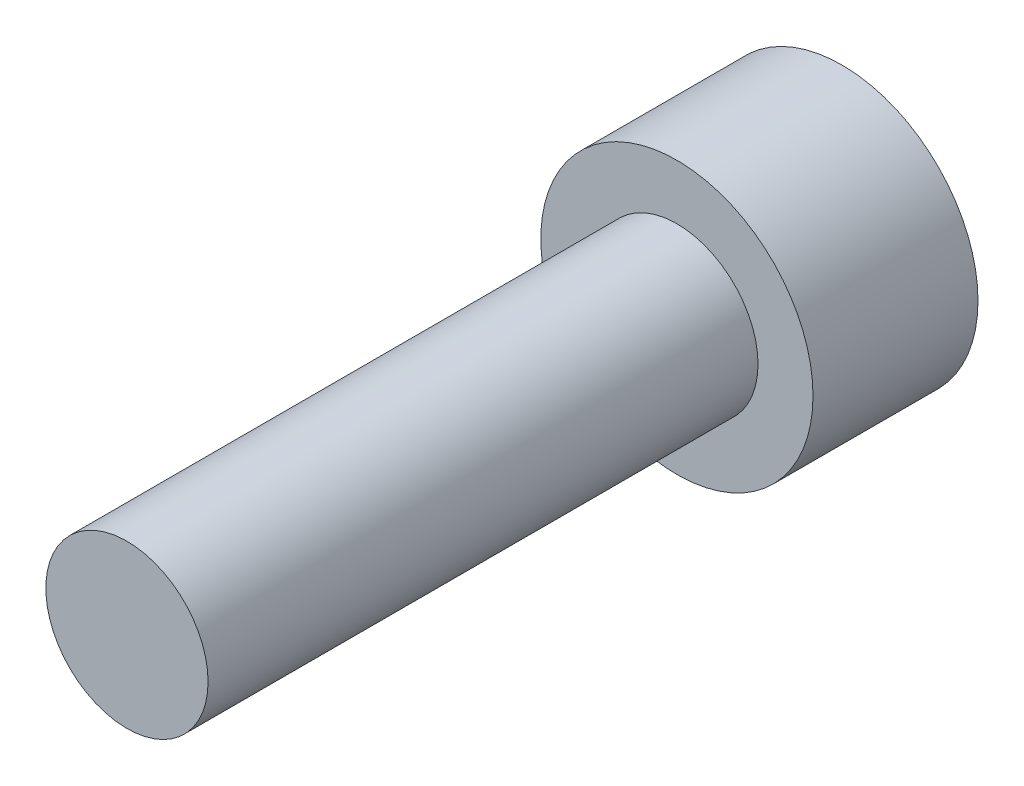
ISO-10303-21;
HEADER;
FILE_DESCRIPTION(('STEP AP214'),'2;1');
FILE_NAME('part.step','',(''),(''),'','','');
FILE_SCHEMA(('AUTOMOTIVE_DESIGN { 1 0 10303 214 1 1 1 1 }'));
ENDSEC;
DATA;
#1=APPLICATION_CONTEXT('core data for automotive mechanical design processes');
#2=APPLICATION_PROTOCOL_DEFINITION('international standard','automotive_design',2000,#1);
#3=PRODUCT_CONTEXT('',#1,'mechanical');
#4=PRODUCT('Part','Part','',(#3));
#5=PRODUCT_RELATED_PRODUCT_CATEGORY('part','',(#4));
#6=PRODUCT_DEFINITION_FORMATION('','',#4);
#7=PRODUCT_DEFINITION_CONTEXT('part definition',#1,'design');
#8=PRODUCT_DEFINITION('design','',#6,#7);
#9=PRODUCT_DEFINITION_SHAPE('','',#8);
#10=(LENGTH_UNIT() NAMED_UNIT(*) SI_UNIT(.MILLI.,.METRE.));
#11=(NAMED_UNIT(*) PLANE_ANGLE_UNIT() SI_UNIT($,.RADIAN.));
#12=(NAMED_UNIT(*) SI_UNIT($,.STERADIAN.) SOLID_ANGLE_UNIT());
#13=UNCERTAINTY_MEASURE_WITH_UNIT(LENGTH_MEASURE(1.E-05),#10,'distance_accuracy_value','');
#14=(GEOMETRIC_REPRESENTATION_CONTEXT(3) GLOBAL_UNCERTAINTY_ASSIGNED_CONTEXT((#13)) GLOBAL_UNIT_ASSIGNED_CONTEXT((#10,
#11,#12)) REPRESENTATION_CONTEXT('',''));
#15=CARTESIAN_POINT('',(0.,0.,0.));
#16=DIRECTION('',(0.,0.,1.));
#17=DIRECTION('',(1.,0.,0.));
#18=AXIS2_PLACEMENT_3D('',#15,#16,#17);
#19=CARTESIAN_POINT('',(0.,0.,6.));
#20=DIRECTION('',(0.,0.,-1.));
#21=DIRECTION('',(-1.,0.,0.));
#22=AXIS2_PLACEMENT_3D('',#19,#20,#21);
#23=CYLINDRICAL_SURFACE('',#22,4.95);
#24=CARTESIAN_POINT('',(0.,0.,6.));
#25=DIRECTION('',(0.,0.,1.));
#26=DIRECTION('',(1.,0.,0.));
#27=AXIS2_PLACEMENT_3D('',#24,#25,#26);
#28=CIRCLE('',#27,4.95);
#29=CARTESIAN_POINT('',(4.95,0.,6.));
#30=VERTEX_POINT('',#29);
#31=EDGE_CURVE('E40',#30,#30,#28,.T.);
#32=ORIENTED_EDGE('',*,*,#31,.F.);
#33=EDGE_LOOP('',(#32));
#34=FACE_BOUND('',#33,.T.);
#35=CARTESIAN_POINT('',(0.,0.,0.));
#36=DIRECTION('',(0.,0.,1.));
#37=DIRECTION('',(1.,0.,0.));
#38=AXIS2_PLACEMENT_3D('',#35,#36,#37);
#39=CIRCLE('',#38,4.95);
#40=CARTESIAN_POINT('',(4.95,0.,0.));
#41=VERTEX_POINT('',#40);
#42=EDGE_CURVE('E36',#41,#41,#39,.T.);
#43=ORIENTED_EDGE('',*,*,#42,.T.);
#44=EDGE_LOOP('',(#43));
#45=FACE_BOUND('',#44,.T.);
#46=ADVANCED_FACE('F33',(#34,#45),#23,.T.);
#47=CARTESIAN_POINT('',(0.,0.,6.));
#48=DIRECTION('',(0.,0.,1.));
#49=DIRECTION('',(1.,0.,0.));
#50=AXIS2_PLACEMENT_3D('',#47,#48,#49);
#51=PLANE('',#50);
#52=CARTESIAN_POINT('',(0.,0.,6.));
#53=DIRECTION('',(0.,0.,1.));
#54=DIRECTION('',(1.,0.,0.));
#55=AXIS2_PLACEMENT_3D('',#52,#53,#54);
#56=CIRCLE('',#55,2.95);
#57=CARTESIAN_POINT('',(2.95,0.,6.));
#58=VERTEX_POINT('',#57);
#59=EDGE_CURVE('E10',#58,#58,#56,.T.);
#60=ORIENTED_EDGE('',*,*,#59,.F.);
#61=EDGE_LOOP('',(#60));
#62=FACE_BOUND('',#61,.T.);
#63=ORIENTED_EDGE('',*,*,#31,.T.);
#64=EDGE_LOOP('',(#63));
#65=FACE_BOUND('',#64,.T.);
#66=ADVANCED_FACE('F57',(#62,#65),#51,.T.);
#67=CARTESIAN_POINT('',(0.,0.,0.));
#68=DIRECTION('',(0.,0.,1.));
#69=DIRECTION('',(1.,0.,0.));
#70=AXIS2_PLACEMENT_3D('',#67,#68,#69);
#71=PLANE('',#70);
#72=ORIENTED_EDGE('',*,*,#42,.F.);
#73=EDGE_LOOP('',(#72));
#74=FACE_BOUND('',#73,.T.);
#75=ADVANCED_FACE('F54',(#74),#71,.F.);
#76=CARTESIAN_POINT('',(0.,0.,26.));
#77=DIRECTION('',(0.,0.,-1.));
#78=DIRECTION('',(-1.,0.,0.));
#79=AXIS2_PLACEMENT_3D('',#76,#77,#78);
#80=CYLINDRICAL_SURFACE('',#79,2.95);
#81=CARTESIAN_POINT('',(0.,0.,26.));
#82=DIRECTION('',(0.,0.,1.));
#83=DIRECTION('',(1.,0.,0.));
#84=AXIS2_PLACEMENT_3D('',#81,#82,#83);
#85=CIRCLE('',#84,2.95);
#86=CARTESIAN_POINT('',(2.95,0.,26.));
#87=VERTEX_POINT('',#86);
#88=EDGE_CURVE('E46',#87,#87,#85,.T.);
#89=ORIENTED_EDGE('',*,*,#88,.F.);
#90=EDGE_LOOP('',(#89));
#91=FACE_BOUND('',#90,.T.);
#92=ORIENTED_EDGE('',*,*,#59,.T.);
#93=EDGE_LOOP('',(#92));
#94=FACE_BOUND('',#93,.T.);
#95=ADVANCED_FACE('F56',(#91,#94),#80,.T.);
#96=CARTESIAN_POINT('',(0.,0.,26.));
#97=DIRECTION('',(0.,0.,1.));
#98=DIRECTION('',(1.,0.,0.));
#99=AXIS2_PLACEMENT_3D('',#96,#97,#98);
#100=PLANE('',#99);
#101=ORIENTED_EDGE('',*,*,#88,.T.);
#102=EDGE_LOOP('',(#101));
#103=FACE_BOUND('',#102,.T.);
#104=ADVANCED_FACE('F62',(#103),#100,.T.);
#105=CLOSED_SHELL('',(#46,#66,#75,#95,#104));
#106=MANIFOLD_SOLID_BREP('B2',#105);
#107=ADVANCED_BREP_SHAPE_REPRESENTATION('',(#18,#106),#14);
#108=SHAPE_DEFINITION_REPRESENTATION(#9,#107);
ENDSEC;
END-ISO-10303-21;
